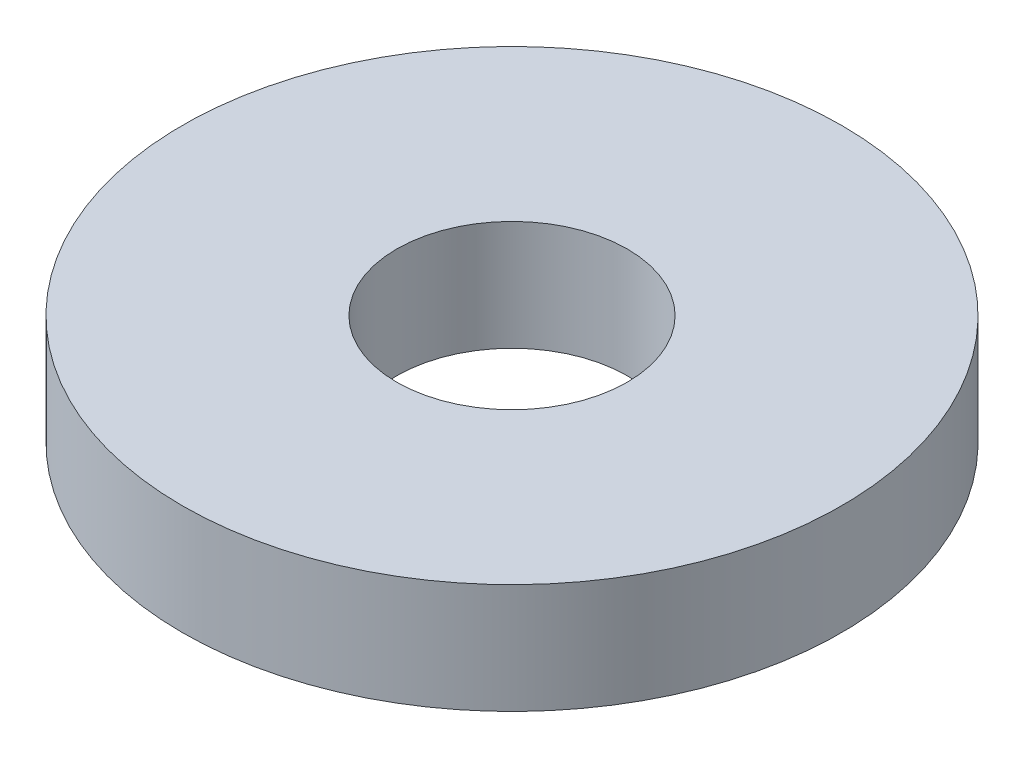
ISO-10303-21;
HEADER;
FILE_DESCRIPTION(('STEP AP214'),'2;1');
FILE_NAME('part.step','',(''),(''),'','','');
FILE_SCHEMA(('AUTOMOTIVE_DESIGN { 1 0 10303 214 1 1 1 1 }'));
ENDSEC;
DATA;
#1=APPLICATION_CONTEXT('core data for automotive mechanical design processes');
#2=APPLICATION_PROTOCOL_DEFINITION('international standard','automotive_design',2000,#1);
#3=PRODUCT_CONTEXT('',#1,'mechanical');
#4=PRODUCT('Part','Part','',(#3));
#5=PRODUCT_RELATED_PRODUCT_CATEGORY('part','',(#4));
#6=PRODUCT_DEFINITION_FORMATION('','',#4);
#7=PRODUCT_DEFINITION_CONTEXT('part definition',#1,'design');
#8=PRODUCT_DEFINITION('design','',#6,#7);
#9=PRODUCT_DEFINITION_SHAPE('','',#8);
#10=(LENGTH_UNIT() NAMED_UNIT(*) SI_UNIT(.MILLI.,.METRE.));
#11=(NAMED_UNIT(*) PLANE_ANGLE_UNIT() SI_UNIT($,.RADIAN.));
#12=(NAMED_UNIT(*) SI_UNIT($,.STERADIAN.) SOLID_ANGLE_UNIT());
#13=UNCERTAINTY_MEASURE_WITH_UNIT(LENGTH_MEASURE(1.E-05),#10,'distance_accuracy_value','');
#14=(GEOMETRIC_REPRESENTATION_CONTEXT(3) GLOBAL_UNCERTAINTY_ASSIGNED_CONTEXT((#13)) GLOBAL_UNIT_ASSIGNED_CONTEXT((#10,
#11,#12)) REPRESENTATION_CONTEXT('',''));
#15=CARTESIAN_POINT('',(0.,0.,0.));
#16=DIRECTION('',(0.,0.,1.));
#17=DIRECTION('',(1.,0.,0.));
#18=AXIS2_PLACEMENT_3D('',#15,#16,#17);
#19=CARTESIAN_POINT('',(0.,2.,0.));
#20=DIRECTION('',(0.,1.,0.));
#21=DIRECTION('',(0.,0.,1.));
#22=AXIS2_PLACEMENT_3D('',#19,#20,#21);
#23=PLANE('',#22);
#24=CARTESIAN_POINT('',(0.,2.,0.));
#25=DIRECTION('',(0.,1.,0.));
#26=DIRECTION('',(0.,0.,1.));
#27=AXIS2_PLACEMENT_3D('',#24,#25,#26);
#28=CIRCLE('',#27,6.);
#29=CARTESIAN_POINT('',(0.,2.,6.));
#30=VERTEX_POINT('',#29);
#31=EDGE_CURVE('E10',#30,#30,#28,.T.);
#32=ORIENTED_EDGE('',*,*,#31,.T.);
#33=EDGE_LOOP('',(#32));
#34=FACE_BOUND('',#33,.T.);
#35=CARTESIAN_POINT('',(0.,2.,0.));
#36=DIRECTION('',(0.,1.,0.));
#37=DIRECTION('',(0.,0.,1.));
#38=AXIS2_PLACEMENT_3D('',#35,#36,#37);
#39=CIRCLE('',#38,2.1);
#40=CARTESIAN_POINT('',(0.,2.,2.1));
#41=VERTEX_POINT('',#40);
#42=EDGE_CURVE('E44',#41,#41,#39,.T.);
#43=ORIENTED_EDGE('',*,*,#42,.F.);
#44=EDGE_LOOP('',(#43));
#45=FACE_BOUND('',#44,.T.);
#46=ADVANCED_FACE('F33',(#34,#45),#23,.T.);
#47=CARTESIAN_POINT('',(0.,0.,0.));
#48=DIRECTION('',(0.,1.,0.));
#49=DIRECTION('',(0.,0.,1.));
#50=AXIS2_PLACEMENT_3D('',#47,#48,#49);
#51=PLANE('',#50);
#52=CARTESIAN_POINT('',(0.,0.,0.));
#53=DIRECTION('',(0.,1.,0.));
#54=DIRECTION('',(0.,0.,1.));
#55=AXIS2_PLACEMENT_3D('',#52,#53,#54);
#56=CIRCLE('',#55,6.);
#57=CARTESIAN_POINT('',(0.,0.,6.));
#58=VERTEX_POINT('',#57);
#59=EDGE_CURVE('E37',#58,#58,#56,.T.);
#60=ORIENTED_EDGE('',*,*,#59,.F.);
#61=EDGE_LOOP('',(#60));
#62=FACE_BOUND('',#61,.T.);
#63=CARTESIAN_POINT('',(0.,0.,0.));
#64=DIRECTION('',(0.,1.,0.));
#65=DIRECTION('',(0.,0.,1.));
#66=AXIS2_PLACEMENT_3D('',#63,#64,#65);
#67=CIRCLE('',#66,2.1);
#68=CARTESIAN_POINT('',(0.,0.,2.1));
#69=VERTEX_POINT('',#68);
#70=EDGE_CURVE('E46',#69,#69,#67,.T.);
#71=ORIENTED_EDGE('',*,*,#70,.T.);
#72=EDGE_LOOP('',(#71));
#73=FACE_BOUND('',#72,.T.);
#74=ADVANCED_FACE('F56',(#62,#73),#51,.F.);
#75=CARTESIAN_POINT('',(0.,2.,0.));
#76=DIRECTION('',(0.,-1.,0.));
#77=DIRECTION('',(0.,0.,-1.));
#78=AXIS2_PLACEMENT_3D('',#75,#76,#77);
#79=CYLINDRICAL_SURFACE('',#78,6.);
#80=ORIENTED_EDGE('',*,*,#31,.F.);
#81=EDGE_LOOP('',(#80));
#82=FACE_BOUND('',#81,.T.);
#83=ORIENTED_EDGE('',*,*,#59,.T.);
#84=EDGE_LOOP('',(#83));
#85=FACE_BOUND('',#84,.T.);
#86=ADVANCED_FACE('F35',(#82,#85),#79,.T.);
#87=CARTESIAN_POINT('',(0.,2.,0.));
#88=DIRECTION('',(0.,-1.,0.));
#89=DIRECTION('',(0.,0.,-1.));
#90=AXIS2_PLACEMENT_3D('',#87,#88,#89);
#91=CYLINDRICAL_SURFACE('',#90,2.1);
#92=ORIENTED_EDGE('',*,*,#42,.T.);
#93=EDGE_LOOP('',(#92));
#94=FACE_BOUND('',#93,.T.);
#95=ORIENTED_EDGE('',*,*,#70,.F.);
#96=EDGE_LOOP('',(#95));
#97=FACE_BOUND('',#96,.T.);
#98=ADVANCED_FACE('F52',(#94,#97),#91,.F.);
#99=CLOSED_SHELL('',(#46,#74,#86,#98));
#100=MANIFOLD_SOLID_BREP('B2',#99);
#101=ADVANCED_BREP_SHAPE_REPRESENTATION('',(#18,#100),#14);
#102=SHAPE_DEFINITION_REPRESENTATION(#9,#101);
ENDSEC;
END-ISO-10303-21;
